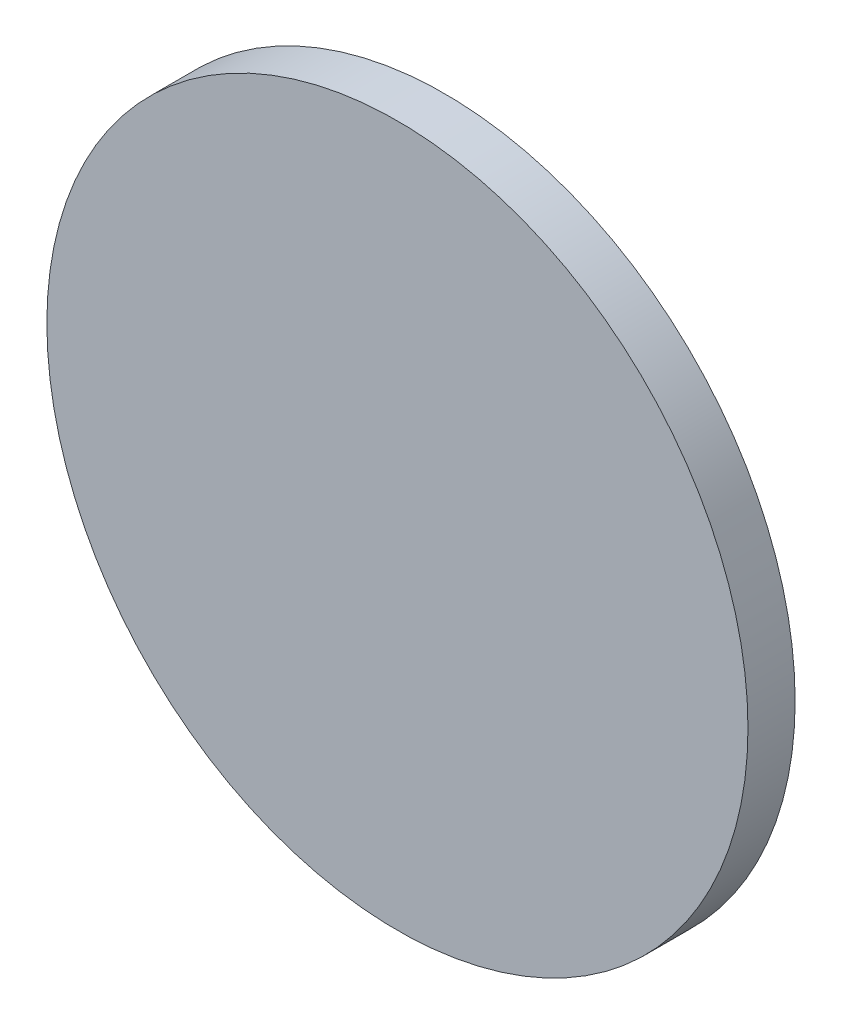
ISO-10303-21;
HEADER;
FILE_DESCRIPTION(('STEP AP214'),'2;1');
FILE_NAME('part.step','',(''),(''),'','','');
FILE_SCHEMA(('AUTOMOTIVE_DESIGN { 1 0 10303 214 1 1 1 1 }'));
ENDSEC;
DATA;
#1=APPLICATION_CONTEXT('core data for automotive mechanical design processes');
#2=APPLICATION_PROTOCOL_DEFINITION('international standard','automotive_design',2000,#1);
#3=PRODUCT_CONTEXT('',#1,'mechanical');
#4=PRODUCT('Part','Part','',(#3));
#5=PRODUCT_RELATED_PRODUCT_CATEGORY('part','',(#4));
#6=PRODUCT_DEFINITION_FORMATION('','',#4);
#7=PRODUCT_DEFINITION_CONTEXT('part definition',#1,'design');
#8=PRODUCT_DEFINITION('design','',#6,#7);
#9=PRODUCT_DEFINITION_SHAPE('','',#8);
#10=(LENGTH_UNIT() NAMED_UNIT(*) SI_UNIT(.MILLI.,.METRE.));
#11=(NAMED_UNIT(*) PLANE_ANGLE_UNIT() SI_UNIT($,.RADIAN.));
#12=(NAMED_UNIT(*) SI_UNIT($,.STERADIAN.) SOLID_ANGLE_UNIT());
#13=UNCERTAINTY_MEASURE_WITH_UNIT(LENGTH_MEASURE(1.E-05),#10,'distance_accuracy_value','');
#14=(GEOMETRIC_REPRESENTATION_CONTEXT(3) GLOBAL_UNCERTAINTY_ASSIGNED_CONTEXT((#13)) GLOBAL_UNIT_ASSIGNED_CONTEXT((#10,
#11,#12)) REPRESENTATION_CONTEXT('',''));
#15=CARTESIAN_POINT('',(0.,0.,0.));
#16=DIRECTION('',(0.,0.,1.));
#17=DIRECTION('',(1.,0.,0.));
#18=AXIS2_PLACEMENT_3D('',#15,#16,#17);
#19=CARTESIAN_POINT('',(0.,0.,10.));
#20=DIRECTION('',(0.,0.,-1.));
#21=DIRECTION('',(-1.,0.,0.));
#22=AXIS2_PLACEMENT_3D('',#19,#20,#21);
#23=CYLINDRICAL_SURFACE('',#22,74.3232394050432);
#24=CARTESIAN_POINT('',(0.,0.,10.));
#25=DIRECTION('',(0.,0.,1.));
#26=DIRECTION('',(1.,0.,0.));
#27=AXIS2_PLACEMENT_3D('',#24,#25,#26);
#28=CIRCLE('',#27,74.3232394050432);
#29=CARTESIAN_POINT('',(74.3232394050432,0.,10.));
#30=VERTEX_POINT('',#29);
#31=EDGE_CURVE('E10',#30,#30,#28,.T.);
#32=ORIENTED_EDGE('',*,*,#31,.F.);
#33=EDGE_LOOP('',(#32));
#34=FACE_BOUND('',#33,.T.);
#35=CARTESIAN_POINT('',(0.,0.,0.));
#36=DIRECTION('',(0.,0.,1.));
#37=DIRECTION('',(1.,0.,0.));
#38=AXIS2_PLACEMENT_3D('',#35,#36,#37);
#39=CIRCLE('',#38,74.3232394050432);
#40=CARTESIAN_POINT('',(74.3232394050432,0.,0.));
#41=VERTEX_POINT('',#40);
#42=EDGE_CURVE('E34',#41,#41,#39,.T.);
#43=ORIENTED_EDGE('',*,*,#42,.T.);
#44=EDGE_LOOP('',(#43));
#45=FACE_BOUND('',#44,.T.);
#46=ADVANCED_FACE('F31',(#34,#45),#23,.T.);
#47=CARTESIAN_POINT('',(0.,0.,10.));
#48=DIRECTION('',(0.,0.,1.));
#49=DIRECTION('',(1.,0.,0.));
#50=AXIS2_PLACEMENT_3D('',#47,#48,#49);
#51=PLANE('',#50);
#52=ORIENTED_EDGE('',*,*,#31,.T.);
#53=EDGE_LOOP('',(#52));
#54=FACE_BOUND('',#53,.T.);
#55=ADVANCED_FACE('F46',(#54),#51,.T.);
#56=CARTESIAN_POINT('',(0.,0.,0.));
#57=DIRECTION('',(0.,0.,1.));
#58=DIRECTION('',(1.,0.,0.));
#59=AXIS2_PLACEMENT_3D('',#56,#57,#58);
#60=PLANE('',#59);
#61=ORIENTED_EDGE('',*,*,#42,.F.);
#62=EDGE_LOOP('',(#61));
#63=FACE_BOUND('',#62,.T.);
#64=ADVANCED_FACE('F44',(#63),#60,.F.);
#65=CLOSED_SHELL('',(#46,#55,#64));
#66=MANIFOLD_SOLID_BREP('B2',#65);
#67=ADVANCED_BREP_SHAPE_REPRESENTATION('',(#18,#66),#14);
#68=SHAPE_DEFINITION_REPRESENTATION(#9,#67);
ENDSEC;
END-ISO-10303-21;
